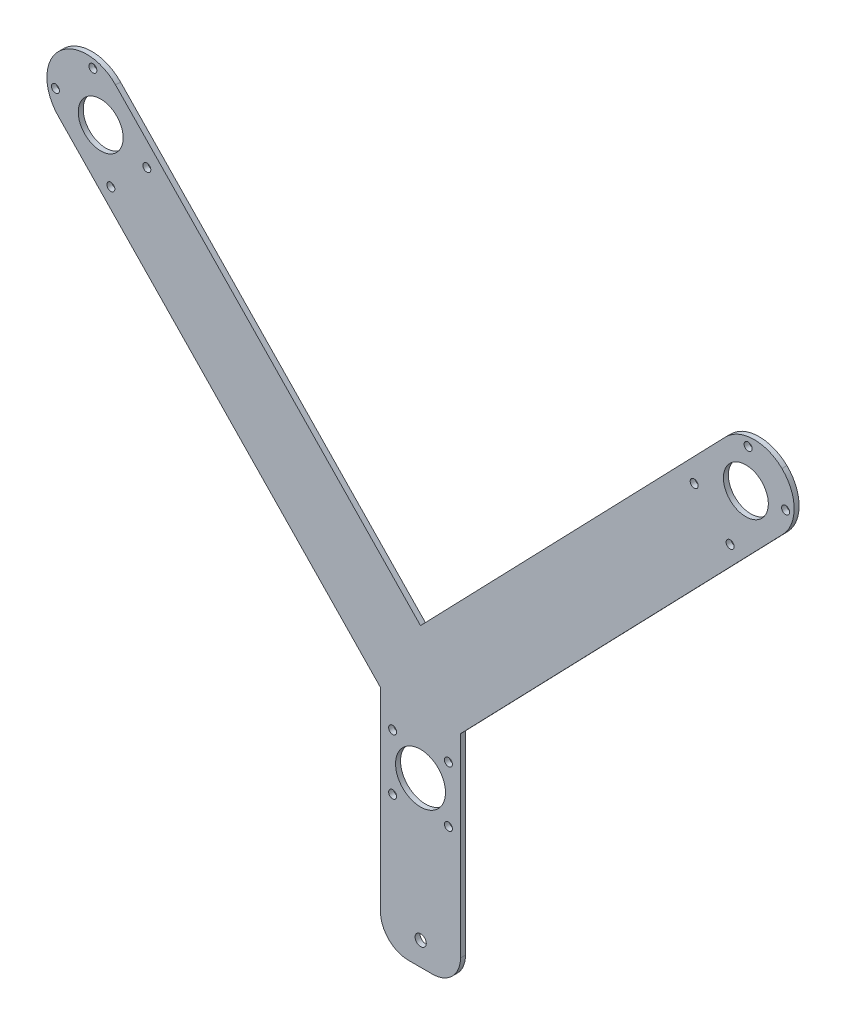
ISO-10303-21;
HEADER;
FILE_DESCRIPTION(('STEP AP214'),'2;1');
FILE_NAME('part.step','',(''),(''),'','','');
FILE_SCHEMA(('AUTOMOTIVE_DESIGN { 1 0 10303 214 1 1 1 1 }'));
ENDSEC;
DATA;
#1=APPLICATION_CONTEXT('core data for automotive mechanical design processes');
#2=APPLICATION_PROTOCOL_DEFINITION('international standard','automotive_design',2000,#1);
#3=PRODUCT_CONTEXT('',#1,'mechanical');
#4=PRODUCT('Part','Part','',(#3));
#5=PRODUCT_RELATED_PRODUCT_CATEGORY('part','',(#4));
#6=PRODUCT_DEFINITION_FORMATION('','',#4);
#7=PRODUCT_DEFINITION_CONTEXT('part definition',#1,'design');
#8=PRODUCT_DEFINITION('design','',#6,#7);
#9=PRODUCT_DEFINITION_SHAPE('','',#8);
#10=(LENGTH_UNIT() NAMED_UNIT(*) SI_UNIT(.MILLI.,.METRE.));
#11=(NAMED_UNIT(*) PLANE_ANGLE_UNIT() SI_UNIT($,.RADIAN.));
#12=(NAMED_UNIT(*) SI_UNIT($,.STERADIAN.) SOLID_ANGLE_UNIT());
#13=UNCERTAINTY_MEASURE_WITH_UNIT(LENGTH_MEASURE(1.E-05),#10,'distance_accuracy_value','');
#14=(GEOMETRIC_REPRESENTATION_CONTEXT(3) GLOBAL_UNCERTAINTY_ASSIGNED_CONTEXT((#13)) GLOBAL_UNIT_ASSIGNED_CONTEXT((#10,
#11,#12)) REPRESENTATION_CONTEXT('',''));
#15=CARTESIAN_POINT('',(0.,0.,0.));
#16=DIRECTION('',(0.,0.,1.));
#17=DIRECTION('',(1.,0.,0.));
#18=AXIS2_PLACEMENT_3D('',#15,#16,#17);
#19=CARTESIAN_POINT('',(0.,0.,3.175));
#20=DIRECTION('',(0.,1.,0.));
#21=DIRECTION('',(0.,0.,1.));
#22=AXIS2_PLACEMENT_3D('',#19,#20,#21);
#23=PLANE('',#22);
#24=DIRECTION('',(1.,0.,0.));
#25=VECTOR('',#24,1.);
#26=CARTESIAN_POINT('',(0.,0.,0.));
#27=LINE('',#26,#25);
#28=CARTESIAN_POINT('',(17.78,0.,0.));
#29=VERTEX_POINT('',#28);
#30=CARTESIAN_POINT('',(33.02,0.,0.));
#31=VERTEX_POINT('',#30);
#32=EDGE_CURVE('E181',#29,#31,#27,.T.);
#33=ORIENTED_EDGE('',*,*,#32,.T.);
#34=DIRECTION('',(0.,0.,-1.));
#35=VECTOR('',#34,1.);
#36=CARTESIAN_POINT('',(33.02,0.,3.175));
#37=LINE('',#36,#35);
#38=CARTESIAN_POINT('',(33.02,0.,3.175));
#39=VERTEX_POINT('',#38);
#40=EDGE_CURVE('E48',#31,#39,#37,.F.);
#41=ORIENTED_EDGE('',*,*,#40,.T.);
#42=DIRECTION('',(1.,0.,0.));
#43=VECTOR('',#42,1.);
#44=CARTESIAN_POINT('',(0.,0.,3.175));
#45=LINE('',#44,#43);
#46=CARTESIAN_POINT('',(17.78,0.,3.175));
#47=VERTEX_POINT('',#46);
#48=EDGE_CURVE('E145',#47,#39,#45,.T.);
#49=ORIENTED_EDGE('',*,*,#48,.F.);
#50=DIRECTION('',(0.,0.,-1.));
#51=VECTOR('',#50,1.);
#52=CARTESIAN_POINT('',(17.78,0.,0.));
#53=LINE('',#52,#51);
#54=EDGE_CURVE('E245',#47,#29,#53,.T.);
#55=ORIENTED_EDGE('',*,*,#54,.T.);
#56=EDGE_LOOP('',(#33,#41,#49,#55));
#57=FACE_BOUND('',#56,.T.);
#58=ADVANCED_FACE('F39',(#57),#23,.F.);
#59=CARTESIAN_POINT('',(50.8,0.,3.175));
#60=DIRECTION('',(-1.,0.,0.));
#61=DIRECTION('',(0.,-1.,0.));
#62=AXIS2_PLACEMENT_3D('',#59,#60,#61);
#63=PLANE('',#62);
#64=DIRECTION('',(0.,1.,0.));
#65=VECTOR('',#64,1.);
#66=CARTESIAN_POINT('',(50.8,0.,3.175));
#67=LINE('',#66,#65);
#68=CARTESIAN_POINT('',(50.8,17.78,3.175));
#69=VERTEX_POINT('',#68);
#70=CARTESIAN_POINT('',(50.8,141.300925348206,3.175));
#71=VERTEX_POINT('',#70);
#72=EDGE_CURVE('E135',#69,#71,#67,.T.);
#73=ORIENTED_EDGE('',*,*,#72,.F.);
#74=DIRECTION('',(0.,0.,-1.));
#75=VECTOR('',#74,1.);
#76=CARTESIAN_POINT('',(50.8,17.78,3.175));
#77=LINE('',#76,#75);
#78=CARTESIAN_POINT('',(50.8,17.78,0.));
#79=VERTEX_POINT('',#78);
#80=EDGE_CURVE('E268',#69,#79,#77,.T.);
#81=ORIENTED_EDGE('',*,*,#80,.T.);
#82=DIRECTION('',(0.,1.,0.));
#83=VECTOR('',#82,1.);
#84=CARTESIAN_POINT('',(50.8,0.,0.));
#85=LINE('',#84,#83);
#86=CARTESIAN_POINT('',(50.8,141.300925348206,0.));
#87=VERTEX_POINT('',#86);
#88=EDGE_CURVE('E150',#79,#87,#85,.T.);
#89=ORIENTED_EDGE('',*,*,#88,.T.);
#90=DIRECTION('',(0.,0.,-1.));
#91=VECTOR('',#90,1.);
#92=CARTESIAN_POINT('',(50.8,141.300925348206,3.175));
#93=LINE('',#92,#91);
#94=EDGE_CURVE('E148',#71,#87,#93,.T.);
#95=ORIENTED_EDGE('',*,*,#94,.F.);
#96=EDGE_LOOP('',(#73,#81,#89,#95));
#97=FACE_BOUND('',#96,.T.);
#98=ADVANCED_FACE('F149',(#97),#63,.F.);
#99=CARTESIAN_POINT('',(50.8,141.300925348206,3.175));
#100=DIRECTION('',(-0.719339800338651,0.694658370458997,0.));
#101=DIRECTION('',(-0.694658370458997,-0.719339800338651,0.));
#102=AXIS2_PLACEMENT_3D('',#99,#100,#101);
#103=PLANE('',#102);
#104=DIRECTION('',(0.694658370458997,0.719339800338651,0.));
#105=VECTOR('',#104,1.);
#106=CARTESIAN_POINT('',(50.8,141.300925348206,0.));
#107=LINE('',#106,#105);
#108=CARTESIAN_POINT('',(255.830470979515,353.616193298251,0.));
#109=VERTEX_POINT('',#108);
#110=EDGE_CURVE('E187',#87,#109,#107,.T.);
#111=ORIENTED_EDGE('',*,*,#110,.T.);
#112=DIRECTION('',(0.,0.,-1.));
#113=VECTOR('',#112,1.);
#114=CARTESIAN_POINT('',(255.830470979515,353.616193298251,3.175));
#115=LINE('',#114,#113);
#116=CARTESIAN_POINT('',(255.830470979515,353.616193298251,3.175));
#117=VERTEX_POINT('',#116);
#118=EDGE_CURVE('E161',#109,#117,#115,.F.);
#119=ORIENTED_EDGE('',*,*,#118,.T.);
#120=DIRECTION('',(0.694658370458997,0.719339800338651,0.));
#121=VECTOR('',#120,1.);
#122=CARTESIAN_POINT('',(50.8,141.300925348206,3.175));
#123=LINE('',#122,#121);
#124=EDGE_CURVE('E139',#71,#117,#123,.T.);
#125=ORIENTED_EDGE('',*,*,#124,.F.);
#126=ORIENTED_EDGE('',*,*,#94,.T.);
#127=EDGE_LOOP('',(#111,#119,#125,#126));
#128=FACE_BOUND('',#127,.T.);
#129=ADVANCED_FACE('F159',(#128),#103,.F.);
#130=CARTESIAN_POINT('',(25.4000000000002,188.127927590913,3.175));
#131=DIRECTION('',(-0.719339800338651,0.694658370458997,0.));
#132=DIRECTION('',(-0.694658370458997,-0.719339800338651,0.));
#133=AXIS2_PLACEMENT_3D('',#130,#131,#132);
#134=PLANE('',#133);
#135=DIRECTION('',(0.694658370458997,0.719339800338651,0.));
#136=VECTOR('',#135,1.);
#137=CARTESIAN_POINT('',(25.4000000000002,188.127927590913,3.175));
#138=LINE('',#137,#136);
#139=CARTESIAN_POINT('',(25.4000000000002,188.127927590913,3.175));
#140=VERTEX_POINT('',#139);
#141=CARTESIAN_POINT('',(219.288009122311,388.904838517568,3.175));
#142=VERTEX_POINT('',#141);
#143=EDGE_CURVE('E163',#140,#142,#138,.T.);
#144=ORIENTED_EDGE('',*,*,#143,.T.);
#145=DIRECTION('',(0.,0.,-1.));
#146=VECTOR('',#145,1.);
#147=CARTESIAN_POINT('',(219.288009122311,388.904838517568,3.175));
#148=LINE('',#147,#146);
#149=CARTESIAN_POINT('',(219.288009122311,388.904838517568,0.));
#150=VERTEX_POINT('',#149);
#151=EDGE_CURVE('E235',#142,#150,#148,.T.);
#152=ORIENTED_EDGE('',*,*,#151,.T.);
#153=DIRECTION('',(0.694658370458997,0.719339800338651,0.));
#154=VECTOR('',#153,1.);
#155=CARTESIAN_POINT('',(25.4000000000002,188.127927590913,0.));
#156=LINE('',#155,#154);
#157=CARTESIAN_POINT('',(25.4000000000002,188.127927590913,0.));
#158=VERTEX_POINT('',#157);
#159=EDGE_CURVE('E190',#158,#150,#156,.T.);
#160=ORIENTED_EDGE('',*,*,#159,.F.);
#161=DIRECTION('',(0.,0.,-1.));
#162=VECTOR('',#161,1.);
#163=CARTESIAN_POINT('',(25.4000000000002,188.127927590913,3.175));
#164=LINE('',#163,#162);
#165=EDGE_CURVE('E156',#140,#158,#164,.T.);
#166=ORIENTED_EDGE('',*,*,#165,.F.);
#167=EDGE_LOOP('',(#144,#152,#160,#166));
#168=FACE_BOUND('',#167,.T.);
#169=ADVANCED_FACE('F287',(#168),#134,.T.);
#170=CARTESIAN_POINT('',(-186.132331731969,407.176069446171,3.175));
#171=DIRECTION('',(0.719339800338653,0.694658370458995,0.));
#172=DIRECTION('',(-0.694658370458995,0.719339800338653,0.));
#173=AXIS2_PLACEMENT_3D('',#170,#171,#172);
#174=PLANE('',#173);
#175=DIRECTION('',(0.694658370458995,-0.719339800338653,0.));
#176=VECTOR('',#175,1.);
#177=CARTESIAN_POINT('',(-186.132331731969,407.176069446171,0.));
#178=LINE('',#177,#176);
#179=CARTESIAN_POINT('',(-168.48800912231,388.904838517569,0.));
#180=VERTEX_POINT('',#179);
#181=EDGE_CURVE('E194',#180,#158,#178,.T.);
#182=ORIENTED_EDGE('',*,*,#181,.F.);
#183=DIRECTION('',(0.,0.,-1.));
#184=VECTOR('',#183,1.);
#185=CARTESIAN_POINT('',(-168.48800912231,388.904838517569,3.175));
#186=LINE('',#185,#184);
#187=CARTESIAN_POINT('',(-168.48800912231,388.904838517569,3.175));
#188=VERTEX_POINT('',#187);
#189=EDGE_CURVE('E242',#180,#188,#186,.F.);
#190=ORIENTED_EDGE('',*,*,#189,.T.);
#191=DIRECTION('',(0.694658370458995,-0.719339800338653,0.));
#192=VECTOR('',#191,1.);
#193=CARTESIAN_POINT('',(-186.132331731969,407.176069446171,3.175));
#194=LINE('',#193,#192);
#195=EDGE_CURVE('E167',#188,#140,#194,.T.);
#196=ORIENTED_EDGE('',*,*,#195,.T.);
#197=ORIENTED_EDGE('',*,*,#165,.T.);
#198=EDGE_LOOP('',(#182,#190,#196,#197));
#199=FACE_BOUND('',#198,.T.);
#200=ADVANCED_FACE('F293',(#199),#174,.T.);
#201=CARTESIAN_POINT('',(0.,141.300925348206,3.175));
#202=DIRECTION('',(-0.719339800338653,-0.694658370458995,0.));
#203=DIRECTION('',(0.694658370458995,-0.719339800338653,0.));
#204=AXIS2_PLACEMENT_3D('',#201,#202,#203);
#205=PLANE('',#204);
#206=DIRECTION('',(-0.694658370458995,0.719339800338653,0.));
#207=VECTOR('',#206,1.);
#208=CARTESIAN_POINT('',(0.,141.300925348206,3.175));
#209=LINE('',#208,#207);
#210=CARTESIAN_POINT('',(0.,141.300925348206,3.175));
#211=VERTEX_POINT('',#210);
#212=CARTESIAN_POINT('',(-205.030470979514,353.616193298252,3.175));
#213=VERTEX_POINT('',#212);
#214=EDGE_CURVE('E173',#211,#213,#209,.T.);
#215=ORIENTED_EDGE('',*,*,#214,.T.);
#216=DIRECTION('',(0.,0.,-1.));
#217=VECTOR('',#216,1.);
#218=CARTESIAN_POINT('',(-205.030470979514,353.616193298252,3.175));
#219=LINE('',#218,#217);
#220=CARTESIAN_POINT('',(-205.030470979514,353.616193298252,0.));
#221=VERTEX_POINT('',#220);
#222=EDGE_CURVE('E238',#213,#221,#219,.T.);
#223=ORIENTED_EDGE('',*,*,#222,.T.);
#224=DIRECTION('',(-0.694658370458995,0.719339800338653,0.));
#225=VECTOR('',#224,1.);
#226=CARTESIAN_POINT('',(0.,141.300925348206,0.));
#227=LINE('',#226,#225);
#228=CARTESIAN_POINT('',(0.,141.300925348206,0.));
#229=VERTEX_POINT('',#228);
#230=EDGE_CURVE('E197',#229,#221,#227,.T.);
#231=ORIENTED_EDGE('',*,*,#230,.F.);
#232=DIRECTION('',(0.,0.,-1.));
#233=VECTOR('',#232,1.);
#234=CARTESIAN_POINT('',(0.,141.300925348206,3.175));
#235=LINE('',#234,#233);
#236=EDGE_CURVE('E180',#211,#229,#235,.T.);
#237=ORIENTED_EDGE('',*,*,#236,.F.);
#238=EDGE_LOOP('',(#215,#223,#231,#237));
#239=FACE_BOUND('',#238,.T.);
#240=ADVANCED_FACE('F307',(#239),#205,.T.);
#241=CARTESIAN_POINT('',(0.,0.,3.175));
#242=DIRECTION('',(-1.,0.,0.));
#243=DIRECTION('',(0.,-1.,0.));
#244=AXIS2_PLACEMENT_3D('',#241,#242,#243);
#245=PLANE('',#244);
#246=DIRECTION('',(0.,1.,0.));
#247=VECTOR('',#246,1.);
#248=CARTESIAN_POINT('',(0.,0.,0.));
#249=LINE('',#248,#247);
#250=CARTESIAN_POINT('',(0.,17.78,0.));
#251=VERTEX_POINT('',#250);
#252=EDGE_CURVE('E201',#251,#229,#249,.T.);
#253=ORIENTED_EDGE('',*,*,#252,.F.);
#254=DIRECTION('',(0.,0.,-1.));
#255=VECTOR('',#254,1.);
#256=CARTESIAN_POINT('',(0.,17.78,3.175));
#257=LINE('',#256,#255);
#258=CARTESIAN_POINT('',(0.,17.78,3.175));
#259=VERTEX_POINT('',#258);
#260=EDGE_CURVE('E262',#251,#259,#257,.F.);
#261=ORIENTED_EDGE('',*,*,#260,.T.);
#262=DIRECTION('',(0.,1.,0.));
#263=VECTOR('',#262,1.);
#264=CARTESIAN_POINT('',(0.,0.,3.175));
#265=LINE('',#264,#263);
#266=EDGE_CURVE('E177',#259,#211,#265,.T.);
#267=ORIENTED_EDGE('',*,*,#266,.T.);
#268=ORIENTED_EDGE('',*,*,#236,.T.);
#269=EDGE_LOOP('',(#253,#261,#267,#268));
#270=FACE_BOUND('',#269,.T.);
#271=ADVANCED_FACE('F311',(#270),#245,.T.);
#272=CARTESIAN_POINT('',(0.,0.,3.175));
#273=DIRECTION('',(0.,0.,1.));
#274=DIRECTION('',(1.,0.,0.));
#275=AXIS2_PLACEMENT_3D('',#272,#273,#274);
#276=PLANE('',#275);
#277=CARTESIAN_POINT('',(-182.898211642216,390.87863754672,3.175));
#278=DIRECTION('',(0.,0.,1.));
#279=DIRECTION('',(1.,0.,0.));
#280=AXIS2_PLACEMENT_3D('',#277,#278,#279);
#281=CIRCLE('',#280,2.53999999999998);
#282=CARTESIAN_POINT('',(-180.358211642216,390.87863754672,3.175));
#283=VERTEX_POINT('',#282);
#284=EDGE_CURVE('E386',#283,#283,#281,.T.);
#285=ORIENTED_EDGE('',*,*,#284,.F.);
#286=EDGE_LOOP('',(#285));
#287=FACE_BOUND('',#286,.T.);
#288=CARTESIAN_POINT('',(-206.742931637628,367.852059108732,3.175));
#289=DIRECTION('',(0.,0.,1.));
#290=DIRECTION('',(1.,0.,0.));
#291=AXIS2_PLACEMENT_3D('',#288,#289,#290);
#292=CIRCLE('',#291,2.54000000000001);
#293=CARTESIAN_POINT('',(-204.202931637628,367.852059108732,3.175));
#294=VERTEX_POINT('',#293);
#295=EDGE_CURVE('E433',#294,#294,#292,.T.);
#296=ORIENTED_EDGE('',*,*,#295,.F.);
#297=EDGE_LOOP('',(#296));
#298=FACE_BOUND('',#297,.T.);
#299=CARTESIAN_POINT('',(-148.615247757559,353.365000513602,3.175));
#300=DIRECTION('',(0.,0.,1.));
#301=DIRECTION('',(1.,0.,0.));
#302=AXIS2_PLACEMENT_3D('',#299,#300,#301);
#303=CIRCLE('',#302,2.53999999999998);
#304=CARTESIAN_POINT('',(-146.075247757559,353.365000513602,3.175));
#305=VERTEX_POINT('',#304);
#306=EDGE_CURVE('E425',#305,#305,#303,.T.);
#307=ORIENTED_EDGE('',*,*,#306,.F.);
#308=EDGE_LOOP('',(#307));
#309=FACE_BOUND('',#308,.T.);
#310=CARTESIAN_POINT('',(-171.454286418311,331.309597251529,3.175));
#311=DIRECTION('',(0.,0.,1.));
#312=DIRECTION('',(1.,0.,0.));
#313=AXIS2_PLACEMENT_3D('',#310,#311,#312);
#314=CIRCLE('',#313,2.53999999999998);
#315=CARTESIAN_POINT('',(-168.914286418311,331.309597251529,3.175));
#316=VERTEX_POINT('',#315);
#317=EDGE_CURVE('E417',#316,#316,#314,.T.);
#318=ORIENTED_EDGE('',*,*,#317,.F.);
#319=EDGE_LOOP('',(#318));
#320=FACE_BOUND('',#319,.T.);
#321=CARTESIAN_POINT('',(233.698211642217,390.87863754672,3.175));
#322=DIRECTION('',(0.,0.,-1.));
#323=DIRECTION('',(-1.,0.,0.));
#324=AXIS2_PLACEMENT_3D('',#321,#322,#323);
#325=CIRCLE('',#324,2.53999999999998);
#326=CARTESIAN_POINT('',(231.158211642217,390.87863754672,3.175));
#327=VERTEX_POINT('',#326);
#328=EDGE_CURVE('E377',#327,#327,#325,.T.);
#329=ORIENTED_EDGE('',*,*,#328,.T.);
#330=EDGE_LOOP('',(#329));
#331=FACE_BOUND('',#330,.T.);
#332=CARTESIAN_POINT('',(257.542931637629,367.852059108732,3.175));
#333=DIRECTION('',(0.,0.,-1.));
#334=DIRECTION('',(-1.,0.,0.));
#335=AXIS2_PLACEMENT_3D('',#332,#333,#334);
#336=CIRCLE('',#335,2.54000000000001);
#337=CARTESIAN_POINT('',(255.002931637629,367.852059108732,3.175));
#338=VERTEX_POINT('',#337);
#339=EDGE_CURVE('E402',#338,#338,#336,.T.);
#340=ORIENTED_EDGE('',*,*,#339,.T.);
#341=EDGE_LOOP('',(#340));
#342=FACE_BOUND('',#341,.T.);
#343=CARTESIAN_POINT('',(199.415247757559,353.365000513602,3.175));
#344=DIRECTION('',(0.,0.,-1.));
#345=DIRECTION('',(-1.,0.,0.));
#346=AXIS2_PLACEMENT_3D('',#343,#344,#345);
#347=CIRCLE('',#346,2.53999999999998);
#348=CARTESIAN_POINT('',(196.875247757559,353.365000513602,3.175));
#349=VERTEX_POINT('',#348);
#350=EDGE_CURVE('E394',#349,#349,#347,.T.);
#351=ORIENTED_EDGE('',*,*,#350,.T.);
#352=EDGE_LOOP('',(#351));
#353=FACE_BOUND('',#352,.T.);
#354=CARTESIAN_POINT('',(222.254286418312,331.309597251529,3.175));
#355=DIRECTION('',(0.,0.,-1.));
#356=DIRECTION('',(-1.,0.,0.));
#357=AXIS2_PLACEMENT_3D('',#354,#355,#356);
#358=CIRCLE('',#357,2.53999999999998);
#359=CARTESIAN_POINT('',(219.714286418312,331.309597251529,3.175));
#360=VERTEX_POINT('',#359);
#361=EDGE_CURVE('E385',#360,#360,#358,.T.);
#362=ORIENTED_EDGE('',*,*,#361,.T.);
#363=EDGE_LOOP('',(#362));
#364=FACE_BOUND('',#363,.T.);
#365=CARTESIAN_POINT('',(25.5077324335531,14.9495790814669,3.175));
#366=DIRECTION('',(0.,0.,-1.));
#367=DIRECTION('',(-1.,0.,0.));
#368=AXIS2_PLACEMENT_3D('',#365,#366,#367);
#369=CIRCLE('',#368,3.556);
#370=CARTESIAN_POINT('',(21.9517324335531,14.9495790814669,3.175));
#371=VERTEX_POINT('',#370);
#372=EDGE_CURVE('E255',#371,#371,#369,.T.);
#373=ORIENTED_EDGE('',*,*,#372,.T.);
#374=EDGE_LOOP('',(#373));
#375=FACE_BOUND('',#374,.T.);
#376=CARTESIAN_POINT('',(232.265943268015,365.779146629329,3.175));
#377=DIRECTION('',(0.,0.,1.));
#378=DIRECTION('',(1.,0.,0.));
#379=AXIS2_PLACEMENT_3D('',#376,#377,#378);
#380=CIRCLE('',#379,14.2875);
#381=CARTESIAN_POINT('',(246.553443268015,365.779146629329,3.175));
#382=VERTEX_POINT('',#381);
#383=EDGE_CURVE('E336',#382,#382,#380,.T.);
#384=ORIENTED_EDGE('',*,*,#383,.F.);
#385=EDGE_LOOP('',(#384));
#386=FACE_BOUND('',#385,.T.);
#387=CARTESIAN_POINT('',(43.1292,86.4108,3.175));
#388=DIRECTION('',(0.,0.,1.));
#389=DIRECTION('',(1.,0.,0.));
#390=AXIS2_PLACEMENT_3D('',#387,#388,#389);
#391=CIRCLE('',#390,2.54);
#392=CARTESIAN_POINT('',(45.6692,86.4108,3.175));
#393=VERTEX_POINT('',#392);
#394=EDGE_CURVE('E250',#393,#393,#391,.T.);
#395=ORIENTED_EDGE('',*,*,#394,.F.);
#396=EDGE_LOOP('',(#395));
#397=FACE_BOUND('',#396,.T.);
#398=CARTESIAN_POINT('',(7.6708,86.4108,3.175));
#399=DIRECTION('',(0.,0.,1.));
#400=DIRECTION('',(1.,0.,0.));
#401=AXIS2_PLACEMENT_3D('',#398,#399,#400);
#402=CIRCLE('',#401,2.54);
#403=CARTESIAN_POINT('',(10.2108,86.4108,3.175));
#404=VERTEX_POINT('',#403);
#405=EDGE_CURVE('E360',#404,#404,#402,.T.);
#406=ORIENTED_EDGE('',*,*,#405,.F.);
#407=EDGE_LOOP('',(#406));
#408=FACE_BOUND('',#407,.T.);
#409=CARTESIAN_POINT('',(-177.937078746083,362.124900443609,3.175));
#410=DIRECTION('',(0.,0.,1.));
#411=DIRECTION('',(1.,0.,0.));
#412=AXIS2_PLACEMENT_3D('',#409,#410,#411);
#413=CIRCLE('',#412,14.2875);
#414=CARTESIAN_POINT('',(-163.649578746083,362.124900443609,3.175));
#415=VERTEX_POINT('',#414);
#416=EDGE_CURVE('E328',#415,#415,#413,.T.);
#417=ORIENTED_EDGE('',*,*,#416,.F.);
#418=EDGE_LOOP('',(#417));
#419=FACE_BOUND('',#418,.T.);
#420=CARTESIAN_POINT('',(25.4,104.14,3.175));
#421=DIRECTION('',(0.,0.,1.));
#422=DIRECTION('',(1.,0.,0.));
#423=AXIS2_PLACEMENT_3D('',#420,#421,#422);
#424=CIRCLE('',#423,15.875);
#425=CARTESIAN_POINT('',(41.275,104.14,3.175));
#426=VERTEX_POINT('',#425);
#427=EDGE_CURVE('E319',#426,#426,#424,.T.);
#428=ORIENTED_EDGE('',*,*,#427,.F.);
#429=EDGE_LOOP('',(#428));
#430=FACE_BOUND('',#429,.T.);
#431=CARTESIAN_POINT('',(43.1292,121.8692,3.175));
#432=DIRECTION('',(0.,0.,1.));
#433=DIRECTION('',(1.,0.,0.));
#434=AXIS2_PLACEMENT_3D('',#431,#432,#433);
#435=CIRCLE('',#434,2.54);
#436=CARTESIAN_POINT('',(45.6692,121.8692,3.175));
#437=VERTEX_POINT('',#436);
#438=EDGE_CURVE('E346',#437,#437,#435,.T.);
#439=ORIENTED_EDGE('',*,*,#438,.F.);
#440=EDGE_LOOP('',(#439));
#441=FACE_BOUND('',#440,.T.);
#442=CARTESIAN_POINT('',(7.67079999999999,121.8692,3.175));
#443=DIRECTION('',(0.,0.,1.));
#444=DIRECTION('',(1.,0.,0.));
#445=AXIS2_PLACEMENT_3D('',#442,#443,#444);
#446=CIRCLE('',#445,2.54);
#447=CARTESIAN_POINT('',(10.2108,121.8692,3.175));
#448=VERTEX_POINT('',#447);
#449=EDGE_CURVE('E337',#448,#448,#446,.T.);
#450=ORIENTED_EDGE('',*,*,#449,.F.);
#451=EDGE_LOOP('',(#450));
#452=FACE_BOUND('',#451,.T.);
#453=ORIENTED_EDGE('',*,*,#48,.T.);
#454=CARTESIAN_POINT('',(33.02,17.78,3.175));
#455=DIRECTION('',(0.,0.,1.));
#456=DIRECTION('',(1.,0.,0.));
#457=AXIS2_PLACEMENT_3D('',#454,#455,#456);
#458=CIRCLE('',#457,17.78);
#459=EDGE_CURVE('E11',#39,#69,#458,.T.);
#460=ORIENTED_EDGE('',*,*,#459,.T.);
#461=ORIENTED_EDGE('',*,*,#72,.T.);
#462=ORIENTED_EDGE('',*,*,#124,.T.);
#463=CARTESIAN_POINT('',(237.559240050913,371.26051590791,3.175));
#464=DIRECTION('',(0.,0.,1.));
#465=DIRECTION('',(1.,0.,0.));
#466=AXIS2_PLACEMENT_3D('',#463,#464,#465);
#467=CIRCLE('',#466,25.4);
#468=CARTESIAN_POINT('',(255.203562660571,389.531746836512,3.175));
#469=VERTEX_POINT('',#468);
#470=EDGE_CURVE('E232',#117,#469,#467,.T.);
#471=ORIENTED_EDGE('',*,*,#470,.T.);
#472=CARTESIAN_POINT('',(237.559240050913,371.26051590791,3.175));
#473=DIRECTION('',(0.,0.,1.));
#474=DIRECTION('',(1.,0.,0.));
#475=AXIS2_PLACEMENT_3D('',#472,#473,#474);
#476=CIRCLE('',#475,25.4);
#477=EDGE_CURVE('E229',#469,#142,#476,.T.);
#478=ORIENTED_EDGE('',*,*,#477,.T.);
#479=ORIENTED_EDGE('',*,*,#143,.F.);
#480=ORIENTED_EDGE('',*,*,#195,.F.);
#481=CARTESIAN_POINT('',(-186.759240050912,371.26051590791,3.175));
#482=DIRECTION('',(0.,0.,1.));
#483=DIRECTION('',(1.,0.,0.));
#484=AXIS2_PLACEMENT_3D('',#481,#482,#483);
#485=CIRCLE('',#484,25.4);
#486=CARTESIAN_POINT('',(-204.40356266057,389.531746836512,3.175));
#487=VERTEX_POINT('',#486);
#488=EDGE_CURVE('E223',#188,#487,#485,.T.);
#489=ORIENTED_EDGE('',*,*,#488,.T.);
#490=CARTESIAN_POINT('',(-186.759240050912,371.26051590791,3.175));
#491=DIRECTION('',(0.,0.,1.));
#492=DIRECTION('',(1.,0.,0.));
#493=AXIS2_PLACEMENT_3D('',#490,#491,#492);
#494=CIRCLE('',#493,25.4);
#495=EDGE_CURVE('E226',#487,#213,#494,.T.);
#496=ORIENTED_EDGE('',*,*,#495,.T.);
#497=ORIENTED_EDGE('',*,*,#214,.F.);
#498=ORIENTED_EDGE('',*,*,#266,.F.);
#499=CARTESIAN_POINT('',(17.78,17.78,3.175));
#500=DIRECTION('',(0.,0.,1.));
#501=DIRECTION('',(1.,0.,0.));
#502=AXIS2_PLACEMENT_3D('',#499,#500,#501);
#503=CIRCLE('',#502,17.78);
#504=EDGE_CURVE('E265',#259,#47,#503,.T.);
#505=ORIENTED_EDGE('',*,*,#504,.T.);
#506=EDGE_LOOP('',(#453,#460,#461,#462,#471,#478,#479,#480,#489,#496,#497,#498,#505));
#507=FACE_BOUND('',#506,.T.);
#508=ADVANCED_FACE('F137',(#287,#298,#309,#320,#331,#342,#353,#364,#375,#386,#397,#408,#419,
#430,#441,#452,#507),#276,.T.);
#509=CARTESIAN_POINT('',(0.,0.,0.));
#510=DIRECTION('',(0.,0.,1.));
#511=DIRECTION('',(1.,0.,0.));
#512=AXIS2_PLACEMENT_3D('',#509,#510,#511);
#513=PLANE('',#512);
#514=CARTESIAN_POINT('',(-182.898211642216,390.87863754672,0.));
#515=DIRECTION('',(0.,0.,1.));
#516=DIRECTION('',(1.,0.,0.));
#517=AXIS2_PLACEMENT_3D('',#514,#515,#516);
#518=CIRCLE('',#517,2.53999999999998);
#519=CARTESIAN_POINT('',(-180.358211642216,390.87863754672,0.));
#520=VERTEX_POINT('',#519);
#521=EDGE_CURVE('E437',#520,#520,#518,.T.);
#522=ORIENTED_EDGE('',*,*,#521,.T.);
#523=EDGE_LOOP('',(#522));
#524=FACE_BOUND('',#523,.T.);
#525=CARTESIAN_POINT('',(-206.742931637628,367.852059108732,0.));
#526=DIRECTION('',(0.,0.,1.));
#527=DIRECTION('',(1.,0.,0.));
#528=AXIS2_PLACEMENT_3D('',#525,#526,#527);
#529=CIRCLE('',#528,2.54000000000001);
#530=CARTESIAN_POINT('',(-204.202931637628,367.852059108732,0.));
#531=VERTEX_POINT('',#530);
#532=EDGE_CURVE('E429',#531,#531,#529,.T.);
#533=ORIENTED_EDGE('',*,*,#532,.T.);
#534=EDGE_LOOP('',(#533));
#535=FACE_BOUND('',#534,.T.);
#536=CARTESIAN_POINT('',(-148.615247757559,353.365000513602,0.));
#537=DIRECTION('',(0.,0.,1.));
#538=DIRECTION('',(1.,0.,0.));
#539=AXIS2_PLACEMENT_3D('',#536,#537,#538);
#540=CIRCLE('',#539,2.53999999999998);
#541=CARTESIAN_POINT('',(-146.075247757559,353.365000513602,0.));
#542=VERTEX_POINT('',#541);
#543=EDGE_CURVE('E421',#542,#542,#540,.T.);
#544=ORIENTED_EDGE('',*,*,#543,.T.);
#545=EDGE_LOOP('',(#544));
#546=FACE_BOUND('',#545,.T.);
#547=CARTESIAN_POINT('',(-171.454286418311,331.309597251529,0.));
#548=DIRECTION('',(0.,0.,1.));
#549=DIRECTION('',(1.,0.,0.));
#550=AXIS2_PLACEMENT_3D('',#547,#548,#549);
#551=CIRCLE('',#550,2.53999999999998);
#552=CARTESIAN_POINT('',(-168.914286418311,331.309597251529,0.));
#553=VERTEX_POINT('',#552);
#554=EDGE_CURVE('E413',#553,#553,#551,.T.);
#555=ORIENTED_EDGE('',*,*,#554,.T.);
#556=EDGE_LOOP('',(#555));
#557=FACE_BOUND('',#556,.T.);
#558=CARTESIAN_POINT('',(233.698211642217,390.87863754672,0.));
#559=DIRECTION('',(0.,0.,-1.));
#560=DIRECTION('',(-1.,0.,0.));
#561=AXIS2_PLACEMENT_3D('',#558,#559,#560);
#562=CIRCLE('',#561,2.53999999999998);
#563=CARTESIAN_POINT('',(231.158211642217,390.87863754672,0.));
#564=VERTEX_POINT('',#563);
#565=EDGE_CURVE('E406',#564,#564,#562,.T.);
#566=ORIENTED_EDGE('',*,*,#565,.F.);
#567=EDGE_LOOP('',(#566));
#568=FACE_BOUND('',#567,.T.);
#569=CARTESIAN_POINT('',(257.542931637629,367.852059108732,0.));
#570=DIRECTION('',(0.,0.,-1.));
#571=DIRECTION('',(-1.,0.,0.));
#572=AXIS2_PLACEMENT_3D('',#569,#570,#571);
#573=CIRCLE('',#572,2.54000000000001);
#574=CARTESIAN_POINT('',(255.002931637629,367.852059108732,0.));
#575=VERTEX_POINT('',#574);
#576=EDGE_CURVE('E398',#575,#575,#573,.T.);
#577=ORIENTED_EDGE('',*,*,#576,.F.);
#578=EDGE_LOOP('',(#577));
#579=FACE_BOUND('',#578,.T.);
#580=CARTESIAN_POINT('',(199.415247757559,353.365000513602,0.));
#581=DIRECTION('',(0.,0.,-1.));
#582=DIRECTION('',(-1.,0.,0.));
#583=AXIS2_PLACEMENT_3D('',#580,#581,#582);
#584=CIRCLE('',#583,2.53999999999998);
#585=CARTESIAN_POINT('',(196.875247757559,353.365000513602,0.));
#586=VERTEX_POINT('',#585);
#587=EDGE_CURVE('E390',#586,#586,#584,.T.);
#588=ORIENTED_EDGE('',*,*,#587,.F.);
#589=EDGE_LOOP('',(#588));
#590=FACE_BOUND('',#589,.T.);
#591=CARTESIAN_POINT('',(222.254286418312,331.309597251529,0.));
#592=DIRECTION('',(0.,0.,-1.));
#593=DIRECTION('',(-1.,0.,0.));
#594=AXIS2_PLACEMENT_3D('',#591,#592,#593);
#595=CIRCLE('',#594,2.53999999999998);
#596=CARTESIAN_POINT('',(219.714286418312,331.309597251529,0.));
#597=VERTEX_POINT('',#596);
#598=EDGE_CURVE('E381',#597,#597,#595,.T.);
#599=ORIENTED_EDGE('',*,*,#598,.F.);
#600=EDGE_LOOP('',(#599));
#601=FACE_BOUND('',#600,.T.);
#602=CARTESIAN_POINT('',(25.5077324335531,14.9495790814669,0.));
#603=DIRECTION('',(0.,0.,-1.));
#604=DIRECTION('',(-1.,0.,0.));
#605=AXIS2_PLACEMENT_3D('',#602,#603,#604);
#606=CIRCLE('',#605,3.556);
#607=CARTESIAN_POINT('',(21.9517324335531,14.9495790814669,0.));
#608=VERTEX_POINT('',#607);
#609=EDGE_CURVE('E373',#608,#608,#606,.T.);
#610=ORIENTED_EDGE('',*,*,#609,.F.);
#611=EDGE_LOOP('',(#610));
#612=FACE_BOUND('',#611,.T.);
#613=CARTESIAN_POINT('',(232.265943268015,365.779146629329,0.));
#614=DIRECTION('',(0.,0.,1.));
#615=DIRECTION('',(1.,0.,0.));
#616=AXIS2_PLACEMENT_3D('',#613,#614,#615);
#617=CIRCLE('',#616,14.2875);
#618=CARTESIAN_POINT('',(246.553443268015,365.779146629329,0.));
#619=VERTEX_POINT('',#618);
#620=EDGE_CURVE('E184',#619,#619,#617,.T.);
#621=ORIENTED_EDGE('',*,*,#620,.T.);
#622=EDGE_LOOP('',(#621));
#623=FACE_BOUND('',#622,.T.);
#624=CARTESIAN_POINT('',(43.1292,86.4108,0.));
#625=DIRECTION('',(0.,0.,1.));
#626=DIRECTION('',(1.,0.,0.));
#627=AXIS2_PLACEMENT_3D('',#624,#625,#626);
#628=CIRCLE('',#627,2.54);
#629=CARTESIAN_POINT('',(45.6692,86.4108,0.));
#630=VERTEX_POINT('',#629);
#631=EDGE_CURVE('E356',#630,#630,#628,.T.);
#632=ORIENTED_EDGE('',*,*,#631,.T.);
#633=EDGE_LOOP('',(#632));
#634=FACE_BOUND('',#633,.T.);
#635=CARTESIAN_POINT('',(7.6708,86.4108,0.));
#636=DIRECTION('',(0.,0.,1.));
#637=DIRECTION('',(1.,0.,0.));
#638=AXIS2_PLACEMENT_3D('',#635,#636,#637);
#639=CIRCLE('',#638,2.54);
#640=CARTESIAN_POINT('',(10.2108,86.4108,0.));
#641=VERTEX_POINT('',#640);
#642=EDGE_CURVE('E342',#641,#641,#639,.T.);
#643=ORIENTED_EDGE('',*,*,#642,.T.);
#644=EDGE_LOOP('',(#643));
#645=FACE_BOUND('',#644,.T.);
#646=CARTESIAN_POINT('',(-177.937078746083,362.124900443609,0.));
#647=DIRECTION('',(0.,0.,1.));
#648=DIRECTION('',(1.,0.,0.));
#649=AXIS2_PLACEMENT_3D('',#646,#647,#648);
#650=CIRCLE('',#649,14.2875);
#651=CARTESIAN_POINT('',(-163.649578746083,362.124900443609,0.));
#652=VERTEX_POINT('',#651);
#653=EDGE_CURVE('E332',#652,#652,#650,.T.);
#654=ORIENTED_EDGE('',*,*,#653,.T.);
#655=EDGE_LOOP('',(#654));
#656=FACE_BOUND('',#655,.T.);
#657=CARTESIAN_POINT('',(25.4,104.14,0.));
#658=DIRECTION('',(0.,0.,1.));
#659=DIRECTION('',(1.,0.,0.));
#660=AXIS2_PLACEMENT_3D('',#657,#658,#659);
#661=CIRCLE('',#660,15.875);
#662=CARTESIAN_POINT('',(41.275,104.14,0.));
#663=VERTEX_POINT('',#662);
#664=EDGE_CURVE('E323',#663,#663,#661,.T.);
#665=ORIENTED_EDGE('',*,*,#664,.T.);
#666=EDGE_LOOP('',(#665));
#667=FACE_BOUND('',#666,.T.);
#668=CARTESIAN_POINT('',(43.1292,121.8692,0.));
#669=DIRECTION('',(0.,0.,1.));
#670=DIRECTION('',(1.,0.,0.));
#671=AXIS2_PLACEMENT_3D('',#668,#669,#670);
#672=CIRCLE('',#671,2.54);
#673=CARTESIAN_POINT('',(45.6692,121.8692,0.));
#674=VERTEX_POINT('',#673);
#675=EDGE_CURVE('E324',#674,#674,#672,.T.);
#676=ORIENTED_EDGE('',*,*,#675,.T.);
#677=EDGE_LOOP('',(#676));
#678=FACE_BOUND('',#677,.T.);
#679=CARTESIAN_POINT('',(7.67079999999999,121.8692,0.));
#680=DIRECTION('',(0.,0.,1.));
#681=DIRECTION('',(1.,0.,0.));
#682=AXIS2_PLACEMENT_3D('',#679,#680,#681);
#683=CIRCLE('',#682,2.54);
#684=CARTESIAN_POINT('',(10.2108,121.8692,0.));
#685=VERTEX_POINT('',#684);
#686=EDGE_CURVE('E341',#685,#685,#683,.T.);
#687=ORIENTED_EDGE('',*,*,#686,.T.);
#688=EDGE_LOOP('',(#687));
#689=FACE_BOUND('',#688,.T.);
#690=ORIENTED_EDGE('',*,*,#88,.F.);
#691=CARTESIAN_POINT('',(33.02,17.78,0.));
#692=DIRECTION('',(0.,0.,1.));
#693=DIRECTION('',(1.,0.,0.));
#694=AXIS2_PLACEMENT_3D('',#691,#692,#693);
#695=CIRCLE('',#694,17.78);
#696=EDGE_CURVE('E62',#79,#31,#695,.F.);
#697=ORIENTED_EDGE('',*,*,#696,.T.);
#698=ORIENTED_EDGE('',*,*,#32,.F.);
#699=CARTESIAN_POINT('',(17.78,17.78,0.));
#700=DIRECTION('',(0.,0.,1.));
#701=DIRECTION('',(1.,0.,0.));
#702=AXIS2_PLACEMENT_3D('',#699,#700,#701);
#703=CIRCLE('',#702,17.78);
#704=EDGE_CURVE('E259',#29,#251,#703,.F.);
#705=ORIENTED_EDGE('',*,*,#704,.T.);
#706=ORIENTED_EDGE('',*,*,#252,.T.);
#707=ORIENTED_EDGE('',*,*,#230,.T.);
#708=CARTESIAN_POINT('',(-186.759240050912,371.26051590791,0.));
#709=DIRECTION('',(0.,0.,1.));
#710=DIRECTION('',(1.,0.,0.));
#711=AXIS2_PLACEMENT_3D('',#708,#709,#710);
#712=CIRCLE('',#711,25.4);
#713=CARTESIAN_POINT('',(-204.40356266057,389.531746836512,0.));
#714=VERTEX_POINT('',#713);
#715=EDGE_CURVE('E212',#221,#714,#712,.F.);
#716=ORIENTED_EDGE('',*,*,#715,.T.);
#717=CARTESIAN_POINT('',(-186.759240050912,371.26051590791,0.));
#718=DIRECTION('',(0.,0.,1.));
#719=DIRECTION('',(1.,0.,0.));
#720=AXIS2_PLACEMENT_3D('',#717,#718,#719);
#721=CIRCLE('',#720,25.4);
#722=EDGE_CURVE('E155',#714,#180,#721,.F.);
#723=ORIENTED_EDGE('',*,*,#722,.T.);
#724=ORIENTED_EDGE('',*,*,#181,.T.);
#725=ORIENTED_EDGE('',*,*,#159,.T.);
#726=CARTESIAN_POINT('',(237.559240050913,371.26051590791,0.));
#727=DIRECTION('',(0.,0.,1.));
#728=DIRECTION('',(1.,0.,0.));
#729=AXIS2_PLACEMENT_3D('',#726,#727,#728);
#730=CIRCLE('',#729,25.4);
#731=CARTESIAN_POINT('',(255.203562660571,389.531746836512,0.));
#732=VERTEX_POINT('',#731);
#733=EDGE_CURVE('E215',#150,#732,#730,.F.);
#734=ORIENTED_EDGE('',*,*,#733,.T.);
#735=CARTESIAN_POINT('',(237.559240050913,371.26051590791,0.));
#736=DIRECTION('',(0.,0.,1.));
#737=DIRECTION('',(1.,0.,0.));
#738=AXIS2_PLACEMENT_3D('',#735,#736,#737);
#739=CIRCLE('',#738,25.4);
#740=EDGE_CURVE('E218',#732,#109,#739,.F.);
#741=ORIENTED_EDGE('',*,*,#740,.T.);
#742=ORIENTED_EDGE('',*,*,#110,.F.);
#743=EDGE_LOOP('',(#690,#697,#698,#705,#706,#707,#716,#723,#724,#725,#734,#741,#742));
#744=FACE_BOUND('',#743,.T.);
#745=ADVANCED_FACE('F274',(#524,#535,#546,#557,#568,#579,#590,#601,#612,#623,#634,#645,#656,
#667,#678,#689,#744),#513,.F.);
#746=CARTESIAN_POINT('',(7.67079999999999,121.8692,0.));
#747=DIRECTION('',(0.,0.,1.));
#748=DIRECTION('',(1.,0.,0.));
#749=AXIS2_PLACEMENT_3D('',#746,#747,#748);
#750=CYLINDRICAL_SURFACE('',#749,2.54);
#751=ORIENTED_EDGE('',*,*,#686,.F.);
#752=EDGE_LOOP('',(#751));
#753=FACE_BOUND('',#752,.T.);
#754=ORIENTED_EDGE('',*,*,#449,.T.);
#755=EDGE_LOOP('',(#754));
#756=FACE_BOUND('',#755,.T.);
#757=ADVANCED_FACE('F481',(#753,#756),#750,.F.);
#758=CARTESIAN_POINT('',(43.1292,121.8692,0.));
#759=DIRECTION('',(0.,0.,1.));
#760=DIRECTION('',(1.,0.,0.));
#761=AXIS2_PLACEMENT_3D('',#758,#759,#760);
#762=CYLINDRICAL_SURFACE('',#761,2.54);
#763=ORIENTED_EDGE('',*,*,#675,.F.);
#764=EDGE_LOOP('',(#763));
#765=FACE_BOUND('',#764,.T.);
#766=ORIENTED_EDGE('',*,*,#438,.T.);
#767=EDGE_LOOP('',(#766));
#768=FACE_BOUND('',#767,.T.);
#769=ADVANCED_FACE('F483',(#765,#768),#762,.F.);
#770=CARTESIAN_POINT('',(25.4,104.14,0.));
#771=DIRECTION('',(0.,0.,1.));
#772=DIRECTION('',(1.,0.,0.));
#773=AXIS2_PLACEMENT_3D('',#770,#771,#772);
#774=CYLINDRICAL_SURFACE('',#773,15.875);
#775=ORIENTED_EDGE('',*,*,#664,.F.);
#776=EDGE_LOOP('',(#775));
#777=FACE_BOUND('',#776,.T.);
#778=ORIENTED_EDGE('',*,*,#427,.T.);
#779=EDGE_LOOP('',(#778));
#780=FACE_BOUND('',#779,.T.);
#781=ADVANCED_FACE('F490',(#777,#780),#774,.F.);
#782=CARTESIAN_POINT('',(-177.937078746083,362.124900443609,0.));
#783=DIRECTION('',(0.,0.,1.));
#784=DIRECTION('',(1.,0.,0.));
#785=AXIS2_PLACEMENT_3D('',#782,#783,#784);
#786=CYLINDRICAL_SURFACE('',#785,14.2875);
#787=ORIENTED_EDGE('',*,*,#653,.F.);
#788=EDGE_LOOP('',(#787));
#789=FACE_BOUND('',#788,.T.);
#790=ORIENTED_EDGE('',*,*,#416,.T.);
#791=EDGE_LOOP('',(#790));
#792=FACE_BOUND('',#791,.T.);
#793=ADVANCED_FACE('F535',(#789,#792),#786,.F.);
#794=CARTESIAN_POINT('',(7.6708,86.4108,0.));
#795=DIRECTION('',(0.,0.,1.));
#796=DIRECTION('',(1.,0.,0.));
#797=AXIS2_PLACEMENT_3D('',#794,#795,#796);
#798=CYLINDRICAL_SURFACE('',#797,2.54);
#799=ORIENTED_EDGE('',*,*,#642,.F.);
#800=EDGE_LOOP('',(#799));
#801=FACE_BOUND('',#800,.T.);
#802=ORIENTED_EDGE('',*,*,#405,.T.);
#803=EDGE_LOOP('',(#802));
#804=FACE_BOUND('',#803,.T.);
#805=ADVANCED_FACE('F532',(#801,#804),#798,.F.);
#806=CARTESIAN_POINT('',(43.1292,86.4108,0.));
#807=DIRECTION('',(0.,0.,1.));
#808=DIRECTION('',(1.,0.,0.));
#809=AXIS2_PLACEMENT_3D('',#806,#807,#808);
#810=CYLINDRICAL_SURFACE('',#809,2.54);
#811=ORIENTED_EDGE('',*,*,#631,.F.);
#812=EDGE_LOOP('',(#811));
#813=FACE_BOUND('',#812,.T.);
#814=ORIENTED_EDGE('',*,*,#394,.T.);
#815=EDGE_LOOP('',(#814));
#816=FACE_BOUND('',#815,.T.);
#817=ADVANCED_FACE('F530',(#813,#816),#810,.F.);
#818=CARTESIAN_POINT('',(232.265943268015,365.779146629329,0.));
#819=DIRECTION('',(0.,0.,1.));
#820=DIRECTION('',(1.,0.,0.));
#821=AXIS2_PLACEMENT_3D('',#818,#819,#820);
#822=CYLINDRICAL_SURFACE('',#821,14.2875);
#823=ORIENTED_EDGE('',*,*,#620,.F.);
#824=EDGE_LOOP('',(#823));
#825=FACE_BOUND('',#824,.T.);
#826=ORIENTED_EDGE('',*,*,#383,.T.);
#827=EDGE_LOOP('',(#826));
#828=FACE_BOUND('',#827,.T.);
#829=ADVANCED_FACE('F509',(#825,#828),#822,.F.);
#830=CARTESIAN_POINT('',(237.559240050913,371.26051590791,3.175));
#831=DIRECTION('',(0.,0.,-1.));
#832=DIRECTION('',(-1.,0.,0.));
#833=AXIS2_PLACEMENT_3D('',#830,#831,#832);
#834=CYLINDRICAL_SURFACE('',#833,25.4);
#835=ORIENTED_EDGE('',*,*,#151,.F.);
#836=ORIENTED_EDGE('',*,*,#477,.F.);
#837=DIRECTION('',(0.,0.,-1.));
#838=VECTOR('',#837,1.);
#839=CARTESIAN_POINT('',(255.203562660571,389.531746836512,3.175));
#840=LINE('',#839,#838);
#841=EDGE_CURVE('E246',#732,#469,#840,.F.);
#842=ORIENTED_EDGE('',*,*,#841,.F.);
#843=ORIENTED_EDGE('',*,*,#733,.F.);
#844=EDGE_LOOP('',(#835,#836,#842,#843));
#845=FACE_BOUND('',#844,.T.);
#846=ADVANCED_FACE('F283',(#845),#834,.T.);
#847=CARTESIAN_POINT('',(237.559240050913,371.26051590791,3.175));
#848=DIRECTION('',(0.,0.,1.));
#849=DIRECTION('',(1.,0.,0.));
#850=AXIS2_PLACEMENT_3D('',#847,#848,#849);
#851=CYLINDRICAL_SURFACE('',#850,25.4);
#852=ORIENTED_EDGE('',*,*,#470,.F.);
#853=ORIENTED_EDGE('',*,*,#118,.F.);
#854=ORIENTED_EDGE('',*,*,#740,.F.);
#855=ORIENTED_EDGE('',*,*,#841,.T.);
#856=EDGE_LOOP('',(#852,#853,#854,#855));
#857=FACE_BOUND('',#856,.T.);
#858=ADVANCED_FACE('F277',(#857),#851,.T.);
#859=CARTESIAN_POINT('',(-186.759240050912,371.26051590791,3.175));
#860=DIRECTION('',(0.,0.,-1.));
#861=DIRECTION('',(-1.,0.,0.));
#862=AXIS2_PLACEMENT_3D('',#859,#860,#861);
#863=CYLINDRICAL_SURFACE('',#862,25.4);
#864=DIRECTION('',(0.,0.,-1.));
#865=VECTOR('',#864,1.);
#866=CARTESIAN_POINT('',(-204.40356266057,389.531746836512,3.175));
#867=LINE('',#866,#865);
#868=EDGE_CURVE('E251',#487,#714,#867,.T.);
#869=ORIENTED_EDGE('',*,*,#868,.F.);
#870=ORIENTED_EDGE('',*,*,#488,.F.);
#871=ORIENTED_EDGE('',*,*,#189,.F.);
#872=ORIENTED_EDGE('',*,*,#722,.F.);
#873=EDGE_LOOP('',(#869,#870,#871,#872));
#874=FACE_BOUND('',#873,.T.);
#875=ADVANCED_FACE('F298',(#874),#863,.T.);
#876=CARTESIAN_POINT('',(-186.759240050912,371.26051590791,3.175));
#877=DIRECTION('',(0.,0.,-1.));
#878=DIRECTION('',(-1.,0.,0.));
#879=AXIS2_PLACEMENT_3D('',#876,#877,#878);
#880=CYLINDRICAL_SURFACE('',#879,25.4);
#881=ORIENTED_EDGE('',*,*,#495,.F.);
#882=ORIENTED_EDGE('',*,*,#868,.T.);
#883=ORIENTED_EDGE('',*,*,#715,.F.);
#884=ORIENTED_EDGE('',*,*,#222,.F.);
#885=EDGE_LOOP('',(#881,#882,#883,#884));
#886=FACE_BOUND('',#885,.T.);
#887=ADVANCED_FACE('F302',(#886),#880,.T.);
#888=CARTESIAN_POINT('',(25.5077324335531,14.9495790814669,3.175));
#889=DIRECTION('',(0.,0.,-1.));
#890=DIRECTION('',(-1.,0.,0.));
#891=AXIS2_PLACEMENT_3D('',#888,#889,#890);
#892=CYLINDRICAL_SURFACE('',#891,3.556);
#893=ORIENTED_EDGE('',*,*,#372,.F.);
#894=EDGE_LOOP('',(#893));
#895=FACE_BOUND('',#894,.T.);
#896=ORIENTED_EDGE('',*,*,#609,.T.);
#897=EDGE_LOOP('',(#896));
#898=FACE_BOUND('',#897,.T.);
#899=ADVANCED_FACE('F512',(#895,#898),#892,.F.);
#900=CARTESIAN_POINT('',(17.78,17.78,3.175));
#901=DIRECTION('',(0.,0.,1.));
#902=DIRECTION('',(1.,0.,0.));
#903=AXIS2_PLACEMENT_3D('',#900,#901,#902);
#904=CYLINDRICAL_SURFACE('',#903,17.78);
#905=ORIENTED_EDGE('',*,*,#504,.F.);
#906=ORIENTED_EDGE('',*,*,#260,.F.);
#907=ORIENTED_EDGE('',*,*,#704,.F.);
#908=ORIENTED_EDGE('',*,*,#54,.F.);
#909=EDGE_LOOP('',(#905,#906,#907,#908));
#910=FACE_BOUND('',#909,.T.);
#911=ADVANCED_FACE('F316',(#910),#904,.T.);
#912=CARTESIAN_POINT('',(33.02,17.78,3.175));
#913=DIRECTION('',(0.,0.,-1.));
#914=DIRECTION('',(-1.,0.,0.));
#915=AXIS2_PLACEMENT_3D('',#912,#913,#914);
#916=CYLINDRICAL_SURFACE('',#915,17.78);
#917=ORIENTED_EDGE('',*,*,#459,.F.);
#918=ORIENTED_EDGE('',*,*,#40,.F.);
#919=ORIENTED_EDGE('',*,*,#696,.F.);
#920=ORIENTED_EDGE('',*,*,#80,.F.);
#921=EDGE_LOOP('',(#917,#918,#919,#920));
#922=FACE_BOUND('',#921,.T.);
#923=ADVANCED_FACE('F41',(#922),#916,.T.);
#924=CARTESIAN_POINT('',(222.254286418312,331.309597251529,3.175));
#925=DIRECTION('',(0.,0.,-1.));
#926=DIRECTION('',(-1.,0.,0.));
#927=AXIS2_PLACEMENT_3D('',#924,#925,#926);
#928=CYLINDRICAL_SURFACE('',#927,2.53999999999998);
#929=ORIENTED_EDGE('',*,*,#361,.F.);
#930=EDGE_LOOP('',(#929));
#931=FACE_BOUND('',#930,.T.);
#932=ORIENTED_EDGE('',*,*,#598,.T.);
#933=EDGE_LOOP('',(#932));
#934=FACE_BOUND('',#933,.T.);
#935=ADVANCED_FACE('F519',(#931,#934),#928,.F.);
#936=CARTESIAN_POINT('',(199.415247757559,353.365000513602,3.175));
#937=DIRECTION('',(0.,0.,-1.));
#938=DIRECTION('',(-1.,0.,0.));
#939=AXIS2_PLACEMENT_3D('',#936,#937,#938);
#940=CYLINDRICAL_SURFACE('',#939,2.53999999999998);
#941=ORIENTED_EDGE('',*,*,#350,.F.);
#942=EDGE_LOOP('',(#941));
#943=FACE_BOUND('',#942,.T.);
#944=ORIENTED_EDGE('',*,*,#587,.T.);
#945=EDGE_LOOP('',(#944));
#946=FACE_BOUND('',#945,.T.);
#947=ADVANCED_FACE('F653',(#943,#946),#940,.F.);
#948=CARTESIAN_POINT('',(257.542931637629,367.852059108732,3.175));
#949=DIRECTION('',(0.,0.,-1.));
#950=DIRECTION('',(-1.,0.,0.));
#951=AXIS2_PLACEMENT_3D('',#948,#949,#950);
#952=CYLINDRICAL_SURFACE('',#951,2.54000000000001);
#953=ORIENTED_EDGE('',*,*,#339,.F.);
#954=EDGE_LOOP('',(#953));
#955=FACE_BOUND('',#954,.T.);
#956=ORIENTED_EDGE('',*,*,#576,.T.);
#957=EDGE_LOOP('',(#956));
#958=FACE_BOUND('',#957,.T.);
#959=ADVANCED_FACE('F650',(#955,#958),#952,.F.);
#960=CARTESIAN_POINT('',(233.698211642217,390.87863754672,3.175));
#961=DIRECTION('',(0.,0.,-1.));
#962=DIRECTION('',(-1.,0.,0.));
#963=AXIS2_PLACEMENT_3D('',#960,#961,#962);
#964=CYLINDRICAL_SURFACE('',#963,2.53999999999998);
#965=ORIENTED_EDGE('',*,*,#328,.F.);
#966=EDGE_LOOP('',(#965));
#967=FACE_BOUND('',#966,.T.);
#968=ORIENTED_EDGE('',*,*,#565,.T.);
#969=EDGE_LOOP('',(#968));
#970=FACE_BOUND('',#969,.T.);
#971=ADVANCED_FACE('F614',(#967,#970),#964,.F.);
#972=CARTESIAN_POINT('',(-171.454286418311,331.309597251529,3.175));
#973=DIRECTION('',(0.,0.,-1.));
#974=DIRECTION('',(-1.,0.,0.));
#975=AXIS2_PLACEMENT_3D('',#972,#973,#974);
#976=CYLINDRICAL_SURFACE('',#975,2.53999999999998);
#977=ORIENTED_EDGE('',*,*,#317,.T.);
#978=EDGE_LOOP('',(#977));
#979=FACE_BOUND('',#978,.T.);
#980=ORIENTED_EDGE('',*,*,#554,.F.);
#981=EDGE_LOOP('',(#980));
#982=FACE_BOUND('',#981,.T.);
#983=ADVANCED_FACE('F608',(#979,#982),#976,.F.);
#984=CARTESIAN_POINT('',(-148.615247757559,353.365000513602,3.175));
#985=DIRECTION('',(0.,0.,-1.));
#986=DIRECTION('',(-1.,0.,0.));
#987=AXIS2_PLACEMENT_3D('',#984,#985,#986);
#988=CYLINDRICAL_SURFACE('',#987,2.53999999999998);
#989=ORIENTED_EDGE('',*,*,#306,.T.);
#990=EDGE_LOOP('',(#989));
#991=FACE_BOUND('',#990,.T.);
#992=ORIENTED_EDGE('',*,*,#543,.F.);
#993=EDGE_LOOP('',(#992));
#994=FACE_BOUND('',#993,.T.);
#995=ADVANCED_FACE('F613',(#991,#994),#988,.F.);
#996=CARTESIAN_POINT('',(-206.742931637628,367.852059108732,3.175));
#997=DIRECTION('',(0.,0.,-1.));
#998=DIRECTION('',(-1.,0.,0.));
#999=AXIS2_PLACEMENT_3D('',#996,#997,#998);
#1000=CYLINDRICAL_SURFACE('',#999,2.54000000000001);
#1001=ORIENTED_EDGE('',*,*,#295,.T.);
#1002=EDGE_LOOP('',(#1001));
#1003=FACE_BOUND('',#1002,.T.);
#1004=ORIENTED_EDGE('',*,*,#532,.F.);
#1005=EDGE_LOOP('',(#1004));
#1006=FACE_BOUND('',#1005,.T.);
#1007=ADVANCED_FACE('F626',(#1003,#1006),#1000,.F.);
#1008=CARTESIAN_POINT('',(-182.898211642216,390.87863754672,3.175));
#1009=DIRECTION('',(0.,0.,-1.));
#1010=DIRECTION('',(-1.,0.,0.));
#1011=AXIS2_PLACEMENT_3D('',#1008,#1009,#1010);
#1012=CYLINDRICAL_SURFACE('',#1011,2.53999999999998);
#1013=ORIENTED_EDGE('',*,*,#284,.T.);
#1014=EDGE_LOOP('',(#1013));
#1015=FACE_BOUND('',#1014,.T.);
#1016=ORIENTED_EDGE('',*,*,#521,.F.);
#1017=EDGE_LOOP('',(#1016));
#1018=FACE_BOUND('',#1017,.T.);
#1019=ADVANCED_FACE('F445',(#1015,#1018),#1012,.F.);
#1020=CLOSED_SHELL('',(#58,#98,#129,#169,#200,#240,#271,#508,#745,#757,#769,#781,#793,#805,#817,
#829,#846,#858,#875,#887,#899,#911,#923,#935,#947,#959,#971,#983,#995,#1007,#1019));
#1021=MANIFOLD_SOLID_BREP('B2',#1020);
#1022=ADVANCED_BREP_SHAPE_REPRESENTATION('',(#18,#1021),#14);
#1023=SHAPE_DEFINITION_REPRESENTATION(#9,#1022);
ENDSEC;
END-ISO-10303-21;
